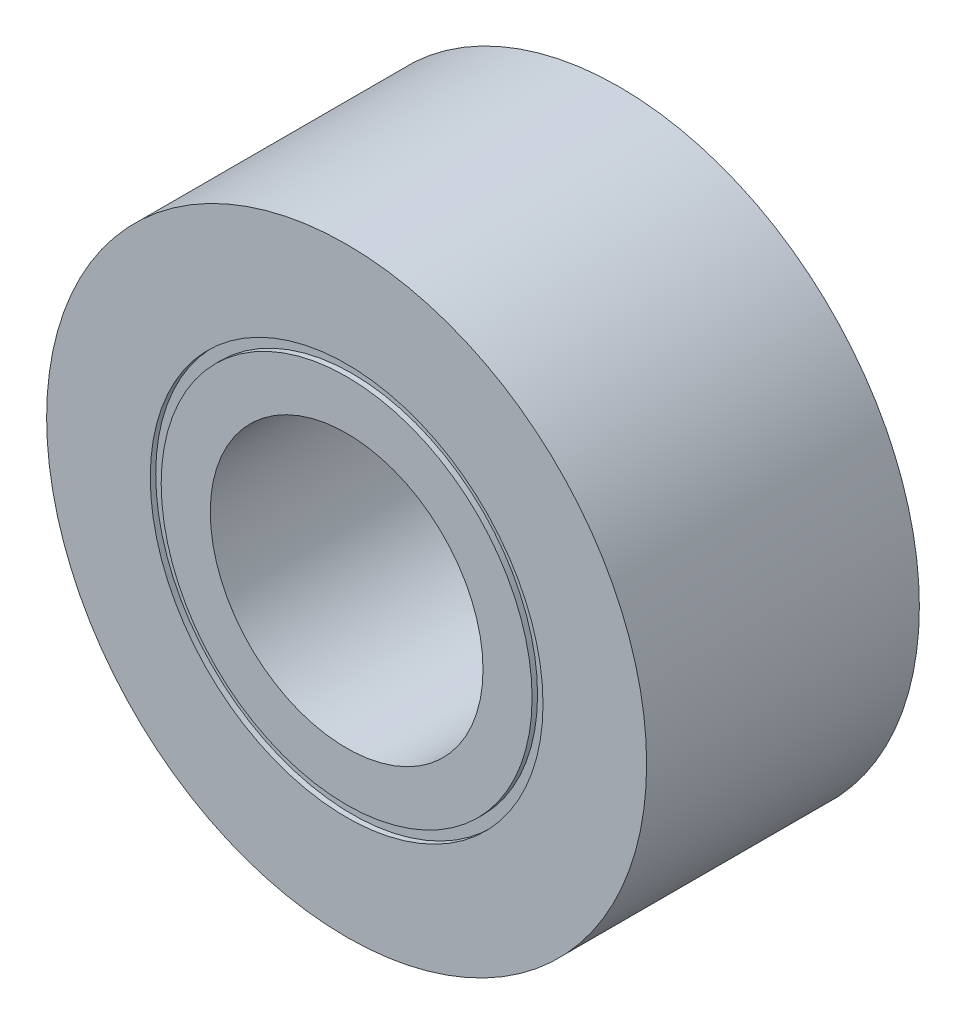
ISO-10303-21;
HEADER;
FILE_DESCRIPTION(('STEP AP214'),'2;1');
FILE_NAME('part.step','',(''),(''),'','','');
FILE_SCHEMA(('AUTOMOTIVE_DESIGN { 1 0 10303 214 1 1 1 1 }'));
ENDSEC;
DATA;
#1=APPLICATION_CONTEXT('core data for automotive mechanical design processes');
#2=APPLICATION_PROTOCOL_DEFINITION('international standard','automotive_design',2000,#1);
#3=PRODUCT_CONTEXT('',#1,'mechanical');
#4=PRODUCT('Part','Part','',(#3));
#5=PRODUCT_RELATED_PRODUCT_CATEGORY('part','',(#4));
#6=PRODUCT_DEFINITION_FORMATION('','',#4);
#7=PRODUCT_DEFINITION_CONTEXT('part definition',#1,'design');
#8=PRODUCT_DEFINITION('design','',#6,#7);
#9=PRODUCT_DEFINITION_SHAPE('','',#8);
#10=(LENGTH_UNIT() NAMED_UNIT(*) SI_UNIT(.MILLI.,.METRE.));
#11=(NAMED_UNIT(*) PLANE_ANGLE_UNIT() SI_UNIT($,.RADIAN.));
#12=(NAMED_UNIT(*) SI_UNIT($,.STERADIAN.) SOLID_ANGLE_UNIT());
#13=UNCERTAINTY_MEASURE_WITH_UNIT(LENGTH_MEASURE(1.E-05),#10,'distance_accuracy_value','');
#14=(GEOMETRIC_REPRESENTATION_CONTEXT(3) GLOBAL_UNCERTAINTY_ASSIGNED_CONTEXT((#13)) GLOBAL_UNIT_ASSIGNED_CONTEXT((#10,
#11,#12)) REPRESENTATION_CONTEXT('',''));
#15=CARTESIAN_POINT('',(0.,0.,0.));
#16=DIRECTION('',(0.,0.,1.));
#17=DIRECTION('',(1.,0.,0.));
#18=AXIS2_PLACEMENT_3D('',#15,#16,#17);
#19=CARTESIAN_POINT('',(0.,0.,0.));
#20=DIRECTION('',(0.,0.,1.));
#21=DIRECTION('',(1.,0.,0.));
#22=AXIS2_PLACEMENT_3D('',#19,#20,#21);
#23=PLANE('',#22);
#24=CARTESIAN_POINT('',(0.,0.,0.));
#25=DIRECTION('',(0.,0.,1.));
#26=DIRECTION('',(1.,0.,0.));
#27=AXIS2_PLACEMENT_3D('',#24,#25,#26);
#28=CIRCLE('',#27,2.5);
#29=CARTESIAN_POINT('',(2.5,0.,0.));
#30=VERTEX_POINT('',#29);
#31=EDGE_CURVE('E44',#30,#30,#28,.T.);
#32=ORIENTED_EDGE('',*,*,#31,.T.);
#33=EDGE_LOOP('',(#32));
#34=FACE_BOUND('',#33,.T.);
#35=CARTESIAN_POINT('',(0.,0.,0.));
#36=DIRECTION('',(0.,0.,-1.));
#37=DIRECTION('',(-1.,0.,0.));
#38=AXIS2_PLACEMENT_3D('',#35,#36,#37);
#39=CIRCLE('',#38,3.4);
#40=CARTESIAN_POINT('',(-3.4,0.,0.));
#41=VERTEX_POINT('',#40);
#42=EDGE_CURVE('E68',#41,#41,#39,.T.);
#43=ORIENTED_EDGE('',*,*,#42,.T.);
#44=EDGE_LOOP('',(#43));
#45=FACE_BOUND('',#44,.T.);
#46=ADVANCED_FACE('F31',(#34,#45),#23,.F.);
#47=CARTESIAN_POINT('',(0.,0.,5.));
#48=DIRECTION('',(0.,0.,1.));
#49=DIRECTION('',(1.,0.,0.));
#50=AXIS2_PLACEMENT_3D('',#47,#48,#49);
#51=PLANE('',#50);
#52=CARTESIAN_POINT('',(0.,0.,5.));
#53=DIRECTION('',(0.,0.,1.));
#54=DIRECTION('',(1.,0.,0.));
#55=AXIS2_PLACEMENT_3D('',#52,#53,#54);
#56=CIRCLE('',#55,2.5);
#57=CARTESIAN_POINT('',(2.5,0.,5.));
#58=VERTEX_POINT('',#57);
#59=EDGE_CURVE('E42',#58,#58,#56,.T.);
#60=ORIENTED_EDGE('',*,*,#59,.F.);
#61=EDGE_LOOP('',(#60));
#62=FACE_BOUND('',#61,.T.);
#63=CARTESIAN_POINT('',(0.,0.,5.));
#64=DIRECTION('',(0.,0.,1.));
#65=DIRECTION('',(1.,0.,0.));
#66=AXIS2_PLACEMENT_3D('',#63,#64,#65);
#67=CIRCLE('',#66,3.4);
#68=CARTESIAN_POINT('',(3.4,0.,5.));
#69=VERTEX_POINT('',#68);
#70=EDGE_CURVE('E56',#69,#69,#67,.T.);
#71=ORIENTED_EDGE('',*,*,#70,.T.);
#72=EDGE_LOOP('',(#71));
#73=FACE_BOUND('',#72,.T.);
#74=ADVANCED_FACE('F107',(#62,#73),#51,.T.);
#75=CARTESIAN_POINT('',(0.,0.,5.));
#76=DIRECTION('',(0.,0.,1.));
#77=DIRECTION('',(1.,0.,0.));
#78=AXIS2_PLACEMENT_3D('',#75,#76,#77);
#79=CIRCLE('',#78,3.6);
#80=CARTESIAN_POINT('',(3.6,0.,5.));
#81=VERTEX_POINT('',#80);
#82=EDGE_CURVE('E50',#81,#81,#79,.T.);
#83=ORIENTED_EDGE('',*,*,#82,.F.);
#84=EDGE_LOOP('',(#83));
#85=FACE_BOUND('',#84,.T.);
#86=CARTESIAN_POINT('',(0.,0.,5.));
#87=DIRECTION('',(0.,0.,1.));
#88=DIRECTION('',(1.,0.,0.));
#89=AXIS2_PLACEMENT_3D('',#86,#87,#88);
#90=CIRCLE('',#89,5.5);
#91=CARTESIAN_POINT('',(5.5,0.,5.));
#92=VERTEX_POINT('',#91);
#93=EDGE_CURVE('E10',#92,#92,#90,.T.);
#94=ORIENTED_EDGE('',*,*,#93,.T.);
#95=EDGE_LOOP('',(#94));
#96=FACE_BOUND('',#95,.T.);
#97=ADVANCED_FACE('F93',(#85,#96),#51,.T.);
#98=CARTESIAN_POINT('',(0.,0.,0.));
#99=DIRECTION('',(0.,0.,-1.));
#100=DIRECTION('',(-1.,0.,0.));
#101=AXIS2_PLACEMENT_3D('',#98,#99,#100);
#102=CIRCLE('',#101,3.8);
#103=CARTESIAN_POINT('',(-3.8,0.,0.));
#104=VERTEX_POINT('',#103);
#105=EDGE_CURVE('E62',#104,#104,#102,.T.);
#106=ORIENTED_EDGE('',*,*,#105,.F.);
#107=EDGE_LOOP('',(#106));
#108=FACE_BOUND('',#107,.T.);
#109=CARTESIAN_POINT('',(0.,0.,0.));
#110=DIRECTION('',(0.,0.,1.));
#111=DIRECTION('',(1.,0.,0.));
#112=AXIS2_PLACEMENT_3D('',#109,#110,#111);
#113=CIRCLE('',#112,5.5);
#114=CARTESIAN_POINT('',(5.5,0.,0.));
#115=VERTEX_POINT('',#114);
#116=EDGE_CURVE('E35',#115,#115,#113,.T.);
#117=ORIENTED_EDGE('',*,*,#116,.F.);
#118=EDGE_LOOP('',(#117));
#119=FACE_BOUND('',#118,.T.);
#120=ADVANCED_FACE('F90',(#108,#119),#23,.F.);
#121=CARTESIAN_POINT('',(0.,0.,5.));
#122=DIRECTION('',(0.,0.,-1.));
#123=DIRECTION('',(-1.,0.,0.));
#124=AXIS2_PLACEMENT_3D('',#121,#122,#123);
#125=CYLINDRICAL_SURFACE('',#124,5.5);
#126=ORIENTED_EDGE('',*,*,#93,.F.);
#127=EDGE_LOOP('',(#126));
#128=FACE_BOUND('',#127,.T.);
#129=ORIENTED_EDGE('',*,*,#116,.T.);
#130=EDGE_LOOP('',(#129));
#131=FACE_BOUND('',#130,.T.);
#132=ADVANCED_FACE('F33',(#128,#131),#125,.T.);
#133=CARTESIAN_POINT('',(0.,0.,5.));
#134=DIRECTION('',(0.,0.,-1.));
#135=DIRECTION('',(-1.,0.,0.));
#136=AXIS2_PLACEMENT_3D('',#133,#134,#135);
#137=CYLINDRICAL_SURFACE('',#136,2.5);
#138=ORIENTED_EDGE('',*,*,#59,.T.);
#139=EDGE_LOOP('',(#138));
#140=FACE_BOUND('',#139,.T.);
#141=ORIENTED_EDGE('',*,*,#31,.F.);
#142=EDGE_LOOP('',(#141));
#143=FACE_BOUND('',#142,.T.);
#144=ADVANCED_FACE('F97',(#140,#143),#137,.F.);
#145=CARTESIAN_POINT('',(0.,0.,4.9));
#146=DIRECTION('',(0.,0.,1.));
#147=DIRECTION('',(1.,0.,0.));
#148=AXIS2_PLACEMENT_3D('',#145,#146,#147);
#149=CYLINDRICAL_SURFACE('',#148,3.6);
#150=CARTESIAN_POINT('',(0.,0.,4.9));
#151=DIRECTION('',(0.,0.,1.));
#152=DIRECTION('',(1.,0.,0.));
#153=AXIS2_PLACEMENT_3D('',#150,#151,#152);
#154=CIRCLE('',#153,3.6);
#155=CARTESIAN_POINT('',(3.6,0.,4.9));
#156=VERTEX_POINT('',#155);
#157=EDGE_CURVE('E47',#156,#156,#154,.T.);
#158=ORIENTED_EDGE('',*,*,#157,.F.);
#159=EDGE_LOOP('',(#158));
#160=FACE_BOUND('',#159,.T.);
#161=ORIENTED_EDGE('',*,*,#82,.T.);
#162=EDGE_LOOP('',(#161));
#163=FACE_BOUND('',#162,.T.);
#164=ADVANCED_FACE('F103',(#160,#163),#149,.F.);
#165=CARTESIAN_POINT('',(0.,0.,4.9));
#166=DIRECTION('',(0.,0.,1.));
#167=DIRECTION('',(1.,0.,0.));
#168=AXIS2_PLACEMENT_3D('',#165,#166,#167);
#169=PLANE('',#168);
#170=CARTESIAN_POINT('',(0.,0.,4.9));
#171=DIRECTION('',(0.,0.,1.));
#172=DIRECTION('',(1.,0.,0.));
#173=AXIS2_PLACEMENT_3D('',#170,#171,#172);
#174=CIRCLE('',#173,3.4);
#175=CARTESIAN_POINT('',(3.4,0.,4.9));
#176=VERTEX_POINT('',#175);
#177=EDGE_CURVE('E53',#176,#176,#174,.T.);
#178=ORIENTED_EDGE('',*,*,#177,.F.);
#179=EDGE_LOOP('',(#178));
#180=FACE_BOUND('',#179,.T.);
#181=ORIENTED_EDGE('',*,*,#157,.T.);
#182=EDGE_LOOP('',(#181));
#183=FACE_BOUND('',#182,.T.);
#184=ADVANCED_FACE('F121',(#180,#183),#169,.T.);
#185=CARTESIAN_POINT('',(0.,0.,4.9));
#186=DIRECTION('',(0.,0.,1.));
#187=DIRECTION('',(1.,0.,0.));
#188=AXIS2_PLACEMENT_3D('',#185,#186,#187);
#189=CYLINDRICAL_SURFACE('',#188,3.4);
#190=ORIENTED_EDGE('',*,*,#177,.T.);
#191=EDGE_LOOP('',(#190));
#192=FACE_BOUND('',#191,.T.);
#193=ORIENTED_EDGE('',*,*,#70,.F.);
#194=EDGE_LOOP('',(#193));
#195=FACE_BOUND('',#194,.T.);
#196=ADVANCED_FACE('F86',(#192,#195),#189,.T.);
#197=CARTESIAN_POINT('',(0.,0.,0.1));
#198=DIRECTION('',(0.,0.,-1.));
#199=DIRECTION('',(-1.,0.,0.));
#200=AXIS2_PLACEMENT_3D('',#197,#198,#199);
#201=CYLINDRICAL_SURFACE('',#200,3.8);
#202=CARTESIAN_POINT('',(0.,0.,0.1));
#203=DIRECTION('',(0.,0.,-1.));
#204=DIRECTION('',(-1.,0.,0.));
#205=AXIS2_PLACEMENT_3D('',#202,#203,#204);
#206=CIRCLE('',#205,3.8);
#207=CARTESIAN_POINT('',(-3.8,0.,0.1));
#208=VERTEX_POINT('',#207);
#209=EDGE_CURVE('E59',#208,#208,#206,.T.);
#210=ORIENTED_EDGE('',*,*,#209,.F.);
#211=EDGE_LOOP('',(#210));
#212=FACE_BOUND('',#211,.T.);
#213=ORIENTED_EDGE('',*,*,#105,.T.);
#214=EDGE_LOOP('',(#213));
#215=FACE_BOUND('',#214,.T.);
#216=ADVANCED_FACE('F80',(#212,#215),#201,.F.);
#217=CARTESIAN_POINT('',(0.,0.,0.1));
#218=DIRECTION('',(0.,0.,-1.));
#219=DIRECTION('',(-1.,0.,0.));
#220=AXIS2_PLACEMENT_3D('',#217,#218,#219);
#221=PLANE('',#220);
#222=CARTESIAN_POINT('',(0.,0.,0.1));
#223=DIRECTION('',(0.,0.,-1.));
#224=DIRECTION('',(-1.,0.,0.));
#225=AXIS2_PLACEMENT_3D('',#222,#223,#224);
#226=CIRCLE('',#225,3.4);
#227=CARTESIAN_POINT('',(-3.4,0.,0.1));
#228=VERTEX_POINT('',#227);
#229=EDGE_CURVE('E65',#228,#228,#226,.T.);
#230=ORIENTED_EDGE('',*,*,#229,.F.);
#231=EDGE_LOOP('',(#230));
#232=FACE_BOUND('',#231,.T.);
#233=ORIENTED_EDGE('',*,*,#209,.T.);
#234=EDGE_LOOP('',(#233));
#235=FACE_BOUND('',#234,.T.);
#236=ADVANCED_FACE('F77',(#232,#235),#221,.T.);
#237=CARTESIAN_POINT('',(0.,0.,0.1));
#238=DIRECTION('',(0.,0.,-1.));
#239=DIRECTION('',(-1.,0.,0.));
#240=AXIS2_PLACEMENT_3D('',#237,#238,#239);
#241=CYLINDRICAL_SURFACE('',#240,3.4);
#242=ORIENTED_EDGE('',*,*,#229,.T.);
#243=EDGE_LOOP('',(#242));
#244=FACE_BOUND('',#243,.T.);
#245=ORIENTED_EDGE('',*,*,#42,.F.);
#246=EDGE_LOOP('',(#245));
#247=FACE_BOUND('',#246,.T.);
#248=ADVANCED_FACE('F74',(#244,#247),#241,.T.);
#249=CLOSED_SHELL('',(#46,#74,#97,#120,#132,#144,#164,#184,#196,#216,#236,#248));
#250=MANIFOLD_SOLID_BREP('B2',#249);
#251=ADVANCED_BREP_SHAPE_REPRESENTATION('',(#18,#250),#14);
#252=SHAPE_DEFINITION_REPRESENTATION(#9,#251);
ENDSEC;
END-ISO-10303-21;
